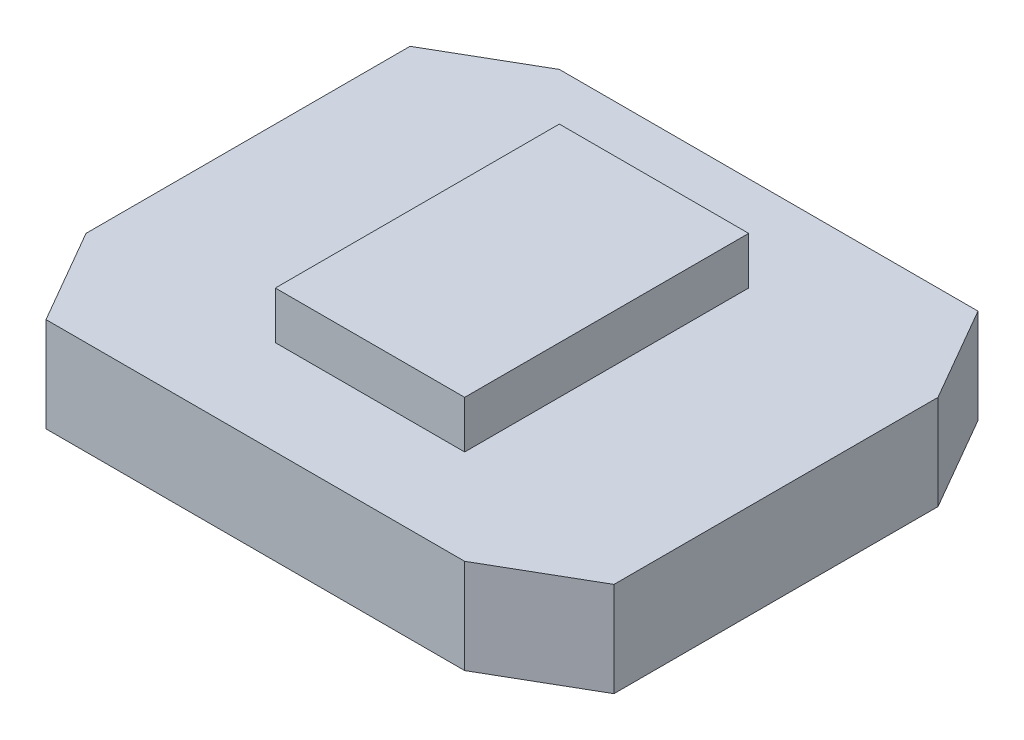
ISO-10303-21;
HEADER;
FILE_DESCRIPTION(('STEP AP214'),'2;1');
FILE_NAME('part.step','',(''),(''),'','','');
FILE_SCHEMA(('AUTOMOTIVE_DESIGN { 1 0 10303 214 1 1 1 1 }'));
ENDSEC;
DATA;
#1=APPLICATION_CONTEXT('core data for automotive mechanical design processes');
#2=APPLICATION_PROTOCOL_DEFINITION('international standard','automotive_design',2000,#1);
#3=PRODUCT_CONTEXT('',#1,'mechanical');
#4=PRODUCT('Part','Part','',(#3));
#5=PRODUCT_RELATED_PRODUCT_CATEGORY('part','',(#4));
#6=PRODUCT_DEFINITION_FORMATION('','',#4);
#7=PRODUCT_DEFINITION_CONTEXT('part definition',#1,'design');
#8=PRODUCT_DEFINITION('design','',#6,#7);
#9=PRODUCT_DEFINITION_SHAPE('','',#8);
#10=(LENGTH_UNIT() NAMED_UNIT(*) SI_UNIT(.MILLI.,.METRE.));
#11=(NAMED_UNIT(*) PLANE_ANGLE_UNIT() SI_UNIT($,.RADIAN.));
#12=(NAMED_UNIT(*) SI_UNIT($,.STERADIAN.) SOLID_ANGLE_UNIT());
#13=UNCERTAINTY_MEASURE_WITH_UNIT(LENGTH_MEASURE(1.E-05),#10,'distance_accuracy_value','');
#14=(GEOMETRIC_REPRESENTATION_CONTEXT(3) GLOBAL_UNCERTAINTY_ASSIGNED_CONTEXT((#13)) GLOBAL_UNIT_ASSIGNED_CONTEXT((#10,
#11,#12)) REPRESENTATION_CONTEXT('',''));
#15=CARTESIAN_POINT('',(0.,0.,0.));
#16=DIRECTION('',(0.,0.,1.));
#17=DIRECTION('',(1.,0.,0.));
#18=AXIS2_PLACEMENT_3D('',#15,#16,#17);
#19=CARTESIAN_POINT('',(30.,15.,-25.));
#20=DIRECTION('',(-1.,0.,0.));
#21=DIRECTION('',(0.,0.,1.));
#22=AXIS2_PLACEMENT_3D('',#19,#20,#21);
#23=PLANE('',#22);
#24=DIRECTION('',(0.,0.,-1.));
#25=VECTOR('',#24,1.);
#26=CARTESIAN_POINT('',(30.,10.,0.));
#27=LINE('',#26,#25);
#28=CARTESIAN_POINT('',(30.,10.,19.2264973081037));
#29=VERTEX_POINT('',#28);
#30=CARTESIAN_POINT('',(30.,10.,-14.9999999999999));
#31=VERTEX_POINT('',#30);
#32=EDGE_CURVE('E134',#29,#31,#27,.T.);
#33=ORIENTED_EDGE('',*,*,#32,.F.);
#34=DIRECTION('',(0.,-1.,0.));
#35=VECTOR('',#34,1.);
#36=CARTESIAN_POINT('',(30.,15.,19.2264973081037));
#37=LINE('',#36,#35);
#38=CARTESIAN_POINT('',(30.,0.,19.2264973081037));
#39=VERTEX_POINT('',#38);
#40=EDGE_CURVE('E156',#29,#39,#37,.T.);
#41=ORIENTED_EDGE('',*,*,#40,.T.);
#42=DIRECTION('',(0.,0.,-1.));
#43=VECTOR('',#42,1.);
#44=CARTESIAN_POINT('',(30.,0.,-25.));
#45=LINE('',#44,#43);
#46=CARTESIAN_POINT('',(30.,0.,-14.9999999999999));
#47=VERTEX_POINT('',#46);
#48=EDGE_CURVE('E196',#39,#47,#45,.T.);
#49=ORIENTED_EDGE('',*,*,#48,.T.);
#50=DIRECTION('',(0.,1.,0.));
#51=VECTOR('',#50,1.);
#52=CARTESIAN_POINT('',(30.,15.,-14.9999999999999));
#53=LINE('',#52,#51);
#54=EDGE_CURVE('E162',#47,#31,#53,.T.);
#55=ORIENTED_EDGE('',*,*,#54,.T.);
#56=EDGE_LOOP('',(#33,#41,#49,#55));
#57=FACE_BOUND('',#56,.T.);
#58=ADVANCED_FACE('F39',(#57),#23,.F.);
#59=CARTESIAN_POINT('',(-30.,15.,-25.));
#60=DIRECTION('',(0.,0.,1.));
#61=DIRECTION('',(1.,0.,0.));
#62=AXIS2_PLACEMENT_3D('',#59,#60,#61);
#63=PLANE('',#62);
#64=DIRECTION('',(-1.,0.,0.));
#65=VECTOR('',#64,1.);
#66=CARTESIAN_POINT('',(0.,10.,-25.));
#67=LINE('',#66,#65);
#68=CARTESIAN_POINT('',(24.2264973081037,10.,-25.));
#69=VERTEX_POINT('',#68);
#70=CARTESIAN_POINT('',(-20.,10.,-25.));
#71=VERTEX_POINT('',#70);
#72=EDGE_CURVE('E131',#69,#71,#67,.T.);
#73=ORIENTED_EDGE('',*,*,#72,.F.);
#74=DIRECTION('',(0.,-1.,0.));
#75=VECTOR('',#74,1.);
#76=CARTESIAN_POINT('',(24.2264973081037,15.,-25.));
#77=LINE('',#76,#75);
#78=CARTESIAN_POINT('',(24.2264973081037,0.,-25.));
#79=VERTEX_POINT('',#78);
#80=EDGE_CURVE('E145',#69,#79,#77,.T.);
#81=ORIENTED_EDGE('',*,*,#80,.T.);
#82=DIRECTION('',(-1.,0.,0.));
#83=VECTOR('',#82,1.);
#84=CARTESIAN_POINT('',(-30.,0.,-25.));
#85=LINE('',#84,#83);
#86=CARTESIAN_POINT('',(-20.,0.,-25.));
#87=VERTEX_POINT('',#86);
#88=EDGE_CURVE('E190',#79,#87,#85,.T.);
#89=ORIENTED_EDGE('',*,*,#88,.T.);
#90=DIRECTION('',(0.,1.,0.));
#91=VECTOR('',#90,1.);
#92=CARTESIAN_POINT('',(-20.,15.,-25.));
#93=LINE('',#92,#91);
#94=EDGE_CURVE('E148',#87,#71,#93,.T.);
#95=ORIENTED_EDGE('',*,*,#94,.T.);
#96=EDGE_LOOP('',(#73,#81,#89,#95));
#97=FACE_BOUND('',#96,.T.);
#98=ADVANCED_FACE('F143',(#97),#63,.F.);
#99=CARTESIAN_POINT('',(-30.,15.,-25.));
#100=DIRECTION('',(1.,0.,0.));
#101=DIRECTION('',(0.,0.,-1.));
#102=AXIS2_PLACEMENT_3D('',#99,#100,#101);
#103=PLANE('',#102);
#104=DIRECTION('',(0.,0.,1.));
#105=VECTOR('',#104,1.);
#106=CARTESIAN_POINT('',(-30.,10.,0.));
#107=LINE('',#106,#105);
#108=CARTESIAN_POINT('',(-30.,10.,-19.2264973081037));
#109=VERTEX_POINT('',#108);
#110=CARTESIAN_POINT('',(-30.,10.,14.9999999999999));
#111=VERTEX_POINT('',#110);
#112=EDGE_CURVE('E63',#109,#111,#107,.T.);
#113=ORIENTED_EDGE('',*,*,#112,.F.);
#114=DIRECTION('',(0.,-1.,0.));
#115=VECTOR('',#114,1.);
#116=CARTESIAN_POINT('',(-30.,15.,-19.2264973081037));
#117=LINE('',#116,#115);
#118=CARTESIAN_POINT('',(-30.,0.,-19.2264973081037));
#119=VERTEX_POINT('',#118);
#120=EDGE_CURVE('E182',#109,#119,#117,.T.);
#121=ORIENTED_EDGE('',*,*,#120,.T.);
#122=DIRECTION('',(0.,0.,1.));
#123=VECTOR('',#122,1.);
#124=CARTESIAN_POINT('',(-30.,0.,-25.));
#125=LINE('',#124,#123);
#126=CARTESIAN_POINT('',(-30.,0.,14.9999999999999));
#127=VERTEX_POINT('',#126);
#128=EDGE_CURVE('E187',#119,#127,#125,.T.);
#129=ORIENTED_EDGE('',*,*,#128,.T.);
#130=DIRECTION('',(0.,1.,0.));
#131=VECTOR('',#130,1.);
#132=CARTESIAN_POINT('',(-30.,15.,14.9999999999999));
#133=LINE('',#132,#131);
#134=EDGE_CURVE('E177',#127,#111,#133,.T.);
#135=ORIENTED_EDGE('',*,*,#134,.T.);
#136=EDGE_LOOP('',(#113,#121,#129,#135));
#137=FACE_BOUND('',#136,.T.);
#138=ADVANCED_FACE('F240',(#137),#103,.F.);
#139=CARTESIAN_POINT('',(-30.,15.,25.));
#140=DIRECTION('',(0.,0.,-1.));
#141=DIRECTION('',(-1.,0.,0.));
#142=AXIS2_PLACEMENT_3D('',#139,#140,#141);
#143=PLANE('',#142);
#144=DIRECTION('',(1.,0.,0.));
#145=VECTOR('',#144,1.);
#146=CARTESIAN_POINT('',(0.,10.,25.));
#147=LINE('',#146,#145);
#148=CARTESIAN_POINT('',(-24.2264973081037,10.,25.));
#149=VERTEX_POINT('',#148);
#150=CARTESIAN_POINT('',(20.,10.,25.));
#151=VERTEX_POINT('',#150);
#152=EDGE_CURVE('E172',#149,#151,#147,.T.);
#153=ORIENTED_EDGE('',*,*,#152,.F.);
#154=DIRECTION('',(0.,-1.,0.));
#155=VECTOR('',#154,1.);
#156=CARTESIAN_POINT('',(-24.2264973081037,15.,25.));
#157=LINE('',#156,#155);
#158=CARTESIAN_POINT('',(-24.2264973081037,0.,25.));
#159=VERTEX_POINT('',#158);
#160=EDGE_CURVE('E48',#149,#159,#157,.T.);
#161=ORIENTED_EDGE('',*,*,#160,.T.);
#162=DIRECTION('',(1.,0.,0.));
#163=VECTOR('',#162,1.);
#164=CARTESIAN_POINT('',(-30.,0.,25.));
#165=LINE('',#164,#163);
#166=CARTESIAN_POINT('',(20.,0.,25.));
#167=VERTEX_POINT('',#166);
#168=EDGE_CURVE('E170',#159,#167,#165,.T.);
#169=ORIENTED_EDGE('',*,*,#168,.T.);
#170=DIRECTION('',(0.,1.,0.));
#171=VECTOR('',#170,1.);
#172=CARTESIAN_POINT('',(20.,15.,25.));
#173=LINE('',#172,#171);
#174=EDGE_CURVE('E11',#167,#151,#173,.T.);
#175=ORIENTED_EDGE('',*,*,#174,.T.);
#176=EDGE_LOOP('',(#153,#161,#169,#175));
#177=FACE_BOUND('',#176,.T.);
#178=ADVANCED_FACE('F168',(#177),#143,.F.);
#179=CARTESIAN_POINT('',(-30.,15.,-19.2264973081037));
#180=DIRECTION('',(0.499999999999999,0.,0.866025403784439));
#181=DIRECTION('',(0.,-1.,0.));
#182=AXIS2_PLACEMENT_3D('',#179,#180,#181);
#183=PLANE('',#182);
#184=ORIENTED_EDGE('',*,*,#120,.F.);
#185=DIRECTION('',(-0.86602540378444,0.,0.499999999999999));
#186=VECTOR('',#185,1.);
#187=CARTESIAN_POINT('',(-15.8253175473054,10.,-27.4102540378444));
#188=LINE('',#187,#186);
#189=EDGE_CURVE('E149',#71,#109,#188,.T.);
#190=ORIENTED_EDGE('',*,*,#189,.F.);
#191=ORIENTED_EDGE('',*,*,#94,.F.);
#192=DIRECTION('',(-0.866025403784439,0.,0.499999999999999));
#193=VECTOR('',#192,1.);
#194=CARTESIAN_POINT('',(-30.,0.,-19.2264973081037));
#195=LINE('',#194,#193);
#196=EDGE_CURVE('E154',#119,#87,#195,.F.);
#197=ORIENTED_EDGE('',*,*,#196,.F.);
#198=EDGE_LOOP('',(#184,#190,#191,#197));
#199=FACE_BOUND('',#198,.T.);
#200=ADVANCED_FACE('F242',(#199),#183,.F.);
#201=CARTESIAN_POINT('',(24.2264973081037,15.,-25.));
#202=DIRECTION('',(-0.86602540378444,0.,0.499999999999998));
#203=DIRECTION('',(0.,-1.,0.));
#204=AXIS2_PLACEMENT_3D('',#201,#202,#203);
#205=PLANE('',#204);
#206=ORIENTED_EDGE('',*,*,#80,.F.);
#207=DIRECTION('',(-0.499999999999998,0.,-0.86602540378444));
#208=VECTOR('',#207,1.);
#209=CARTESIAN_POINT('',(28.9951905283833,10.,-16.7403810567665));
#210=LINE('',#209,#208);
#211=EDGE_CURVE('E127',#31,#69,#210,.T.);
#212=ORIENTED_EDGE('',*,*,#211,.F.);
#213=ORIENTED_EDGE('',*,*,#54,.F.);
#214=DIRECTION('',(-0.499999999999998,0.,-0.86602540378444));
#215=VECTOR('',#214,1.);
#216=CARTESIAN_POINT('',(24.2264973081037,0.,-25.));
#217=LINE('',#216,#215);
#218=EDGE_CURVE('E152',#79,#47,#217,.F.);
#219=ORIENTED_EDGE('',*,*,#218,.F.);
#220=EDGE_LOOP('',(#206,#212,#213,#219));
#221=FACE_BOUND('',#220,.T.);
#222=ADVANCED_FACE('F151',(#221),#205,.F.);
#223=CARTESIAN_POINT('',(30.,15.,19.2264973081037));
#224=DIRECTION('',(-0.499999999999999,0.,-0.86602540378444));
#225=DIRECTION('',(0.,-1.,0.));
#226=AXIS2_PLACEMENT_3D('',#223,#224,#225);
#227=PLANE('',#226);
#228=ORIENTED_EDGE('',*,*,#40,.F.);
#229=DIRECTION('',(0.86602540378444,0.,-0.499999999999999));
#230=VECTOR('',#229,1.);
#231=CARTESIAN_POINT('',(15.8253175473054,10.,27.4102540378444));
#232=LINE('',#231,#230);
#233=EDGE_CURVE('E231',#151,#29,#232,.T.);
#234=ORIENTED_EDGE('',*,*,#233,.F.);
#235=ORIENTED_EDGE('',*,*,#174,.F.);
#236=DIRECTION('',(0.86602540378444,0.,-0.499999999999999));
#237=VECTOR('',#236,1.);
#238=CARTESIAN_POINT('',(30.,0.,19.2264973081037));
#239=LINE('',#238,#237);
#240=EDGE_CURVE('E181',#39,#167,#239,.F.);
#241=ORIENTED_EDGE('',*,*,#240,.F.);
#242=EDGE_LOOP('',(#228,#234,#235,#241));
#243=FACE_BOUND('',#242,.T.);
#244=ADVANCED_FACE('F249',(#243),#227,.F.);
#245=CARTESIAN_POINT('',(-24.2264973081037,15.,25.));
#246=DIRECTION('',(0.86602540378444,0.,-0.499999999999998));
#247=DIRECTION('',(0.,-1.,0.));
#248=AXIS2_PLACEMENT_3D('',#245,#246,#247);
#249=PLANE('',#248);
#250=ORIENTED_EDGE('',*,*,#160,.F.);
#251=DIRECTION('',(0.499999999999998,0.,0.86602540378444));
#252=VECTOR('',#251,1.);
#253=CARTESIAN_POINT('',(-28.9951905283833,10.,16.7403810567665));
#254=LINE('',#253,#252);
#255=EDGE_CURVE('E234',#111,#149,#254,.T.);
#256=ORIENTED_EDGE('',*,*,#255,.F.);
#257=ORIENTED_EDGE('',*,*,#134,.F.);
#258=DIRECTION('',(0.499999999999998,0.,0.86602540378444));
#259=VECTOR('',#258,1.);
#260=CARTESIAN_POINT('',(-24.2264973081037,0.,25.));
#261=LINE('',#260,#259);
#262=EDGE_CURVE('E175',#159,#127,#261,.F.);
#263=ORIENTED_EDGE('',*,*,#262,.F.);
#264=EDGE_LOOP('',(#250,#256,#257,#263));
#265=FACE_BOUND('',#264,.T.);
#266=ADVANCED_FACE('F42',(#265),#249,.F.);
#267=CARTESIAN_POINT('',(0.,0.,0.));
#268=DIRECTION('',(0.,1.,0.));
#269=DIRECTION('',(0.,0.,1.));
#270=AXIS2_PLACEMENT_3D('',#267,#268,#269);
#271=PLANE('',#270);
#272=ORIENTED_EDGE('',*,*,#128,.F.);
#273=ORIENTED_EDGE('',*,*,#196,.T.);
#274=ORIENTED_EDGE('',*,*,#88,.F.);
#275=ORIENTED_EDGE('',*,*,#218,.T.);
#276=ORIENTED_EDGE('',*,*,#48,.F.);
#277=ORIENTED_EDGE('',*,*,#240,.T.);
#278=ORIENTED_EDGE('',*,*,#168,.F.);
#279=ORIENTED_EDGE('',*,*,#262,.T.);
#280=EDGE_LOOP('',(#272,#273,#274,#275,#276,#277,#278,#279));
#281=FACE_BOUND('',#280,.T.);
#282=ADVANCED_FACE('F184',(#281),#271,.F.);
#283=CARTESIAN_POINT('',(0.,10.,-15.));
#284=DIRECTION('',(0.,0.,1.));
#285=DIRECTION('',(1.,0.,0.));
#286=AXIS2_PLACEMENT_3D('',#283,#284,#285);
#287=PLANE('',#286);
#288=DIRECTION('',(1.,0.,0.));
#289=VECTOR('',#288,1.);
#290=CARTESIAN_POINT('',(0.,15.,-15.));
#291=LINE('',#290,#289);
#292=CARTESIAN_POINT('',(-10.,15.,-15.));
#293=VERTEX_POINT('',#292);
#294=CARTESIAN_POINT('',(10.,15.,-15.));
#295=VERTEX_POINT('',#294);
#296=EDGE_CURVE('E55',#293,#295,#291,.T.);
#297=ORIENTED_EDGE('',*,*,#296,.T.);
#298=DIRECTION('',(0.,1.,0.));
#299=VECTOR('',#298,1.);
#300=CARTESIAN_POINT('',(10.,10.,-15.));
#301=LINE('',#300,#299);
#302=CARTESIAN_POINT('',(10.,10.,-15.));
#303=VERTEX_POINT('',#302);
#304=EDGE_CURVE('E204',#303,#295,#301,.T.);
#305=ORIENTED_EDGE('',*,*,#304,.F.);
#306=DIRECTION('',(1.,0.,0.));
#307=VECTOR('',#306,1.);
#308=CARTESIAN_POINT('',(0.,10.,-15.));
#309=LINE('',#308,#307);
#310=CARTESIAN_POINT('',(-10.,10.,-15.));
#311=VERTEX_POINT('',#310);
#312=EDGE_CURVE('E227',#311,#303,#309,.T.);
#313=ORIENTED_EDGE('',*,*,#312,.F.);
#314=DIRECTION('',(0.,1.,0.));
#315=VECTOR('',#314,1.);
#316=CARTESIAN_POINT('',(-10.,10.,-15.));
#317=LINE('',#316,#315);
#318=EDGE_CURVE('E199',#311,#293,#317,.T.);
#319=ORIENTED_EDGE('',*,*,#318,.T.);
#320=EDGE_LOOP('',(#297,#305,#313,#319));
#321=FACE_BOUND('',#320,.T.);
#322=ADVANCED_FACE('F264',(#321),#287,.F.);
#323=CARTESIAN_POINT('',(-10.,10.,0.));
#324=DIRECTION('',(-1.,0.,0.));
#325=DIRECTION('',(0.,0.,1.));
#326=AXIS2_PLACEMENT_3D('',#323,#324,#325);
#327=PLANE('',#326);
#328=DIRECTION('',(0.,0.,1.));
#329=VECTOR('',#328,1.);
#330=CARTESIAN_POINT('',(-10.,15.,0.));
#331=LINE('',#330,#329);
#332=CARTESIAN_POINT('',(-10.,15.,15.));
#333=VERTEX_POINT('',#332);
#334=EDGE_CURVE('E139',#293,#333,#331,.T.);
#335=ORIENTED_EDGE('',*,*,#334,.F.);
#336=ORIENTED_EDGE('',*,*,#318,.F.);
#337=DIRECTION('',(0.,0.,1.));
#338=VECTOR('',#337,1.);
#339=CARTESIAN_POINT('',(-10.,10.,0.));
#340=LINE('',#339,#338);
#341=CARTESIAN_POINT('',(-10.,10.,15.));
#342=VERTEX_POINT('',#341);
#343=EDGE_CURVE('E207',#311,#342,#340,.T.);
#344=ORIENTED_EDGE('',*,*,#343,.T.);
#345=DIRECTION('',(0.,1.,0.));
#346=VECTOR('',#345,1.);
#347=CARTESIAN_POINT('',(-10.,10.,15.));
#348=LINE('',#347,#346);
#349=EDGE_CURVE('E201',#342,#333,#348,.T.);
#350=ORIENTED_EDGE('',*,*,#349,.T.);
#351=EDGE_LOOP('',(#335,#336,#344,#350));
#352=FACE_BOUND('',#351,.T.);
#353=ADVANCED_FACE('F271',(#352),#327,.T.);
#354=CARTESIAN_POINT('',(0.,10.,15.));
#355=DIRECTION('',(0.,0.,1.));
#356=DIRECTION('',(1.,0.,0.));
#357=AXIS2_PLACEMENT_3D('',#354,#355,#356);
#358=PLANE('',#357);
#359=DIRECTION('',(1.,0.,0.));
#360=VECTOR('',#359,1.);
#361=CARTESIAN_POINT('',(0.,15.,15.));
#362=LINE('',#361,#360);
#363=CARTESIAN_POINT('',(10.,15.,15.));
#364=VERTEX_POINT('',#363);
#365=EDGE_CURVE('E213',#333,#364,#362,.T.);
#366=ORIENTED_EDGE('',*,*,#365,.F.);
#367=ORIENTED_EDGE('',*,*,#349,.F.);
#368=DIRECTION('',(1.,0.,0.));
#369=VECTOR('',#368,1.);
#370=CARTESIAN_POINT('',(0.,10.,15.));
#371=LINE('',#370,#369);
#372=CARTESIAN_POINT('',(10.,10.,15.));
#373=VERTEX_POINT('',#372);
#374=EDGE_CURVE('E222',#342,#373,#371,.T.);
#375=ORIENTED_EDGE('',*,*,#374,.T.);
#376=DIRECTION('',(0.,1.,0.));
#377=VECTOR('',#376,1.);
#378=CARTESIAN_POINT('',(10.,10.,15.));
#379=LINE('',#378,#377);
#380=EDGE_CURVE('E206',#373,#364,#379,.T.);
#381=ORIENTED_EDGE('',*,*,#380,.T.);
#382=EDGE_LOOP('',(#366,#367,#375,#381));
#383=FACE_BOUND('',#382,.T.);
#384=ADVANCED_FACE('F275',(#383),#358,.T.);
#385=CARTESIAN_POINT('',(10.,10.,0.));
#386=DIRECTION('',(-1.,0.,0.));
#387=DIRECTION('',(0.,0.,1.));
#388=AXIS2_PLACEMENT_3D('',#385,#386,#387);
#389=PLANE('',#388);
#390=DIRECTION('',(0.,0.,1.));
#391=VECTOR('',#390,1.);
#392=CARTESIAN_POINT('',(10.,15.,0.));
#393=LINE('',#392,#391);
#394=EDGE_CURVE('E216',#295,#364,#393,.T.);
#395=ORIENTED_EDGE('',*,*,#394,.T.);
#396=ORIENTED_EDGE('',*,*,#380,.F.);
#397=DIRECTION('',(0.,0.,1.));
#398=VECTOR('',#397,1.);
#399=CARTESIAN_POINT('',(10.,10.,0.));
#400=LINE('',#399,#398);
#401=EDGE_CURVE('E224',#303,#373,#400,.T.);
#402=ORIENTED_EDGE('',*,*,#401,.F.);
#403=ORIENTED_EDGE('',*,*,#304,.T.);
#404=EDGE_LOOP('',(#395,#396,#402,#403));
#405=FACE_BOUND('',#404,.T.);
#406=ADVANCED_FACE('F272',(#405),#389,.F.);
#407=CARTESIAN_POINT('',(0.,10.,0.));
#408=DIRECTION('',(0.,1.,0.));
#409=DIRECTION('',(0.,0.,1.));
#410=AXIS2_PLACEMENT_3D('',#407,#408,#409);
#411=PLANE('',#410);
#412=ORIENTED_EDGE('',*,*,#211,.T.);
#413=ORIENTED_EDGE('',*,*,#72,.T.);
#414=ORIENTED_EDGE('',*,*,#189,.T.);
#415=ORIENTED_EDGE('',*,*,#112,.T.);
#416=ORIENTED_EDGE('',*,*,#255,.T.);
#417=ORIENTED_EDGE('',*,*,#152,.T.);
#418=ORIENTED_EDGE('',*,*,#233,.T.);
#419=ORIENTED_EDGE('',*,*,#32,.T.);
#420=EDGE_LOOP('',(#412,#413,#414,#415,#416,#417,#418,#419));
#421=FACE_BOUND('',#420,.T.);
#422=ORIENTED_EDGE('',*,*,#312,.T.);
#423=ORIENTED_EDGE('',*,*,#401,.T.);
#424=ORIENTED_EDGE('',*,*,#374,.F.);
#425=ORIENTED_EDGE('',*,*,#343,.F.);
#426=EDGE_LOOP('',(#422,#423,#424,#425));
#427=FACE_BOUND('',#426,.T.);
#428=ADVANCED_FACE('F129',(#421,#427),#411,.T.);
#429=CARTESIAN_POINT('',(0.,15.,0.));
#430=DIRECTION('',(0.,1.,0.));
#431=DIRECTION('',(0.,0.,1.));
#432=AXIS2_PLACEMENT_3D('',#429,#430,#431);
#433=PLANE('',#432);
#434=ORIENTED_EDGE('',*,*,#296,.F.);
#435=ORIENTED_EDGE('',*,*,#334,.T.);
#436=ORIENTED_EDGE('',*,*,#365,.T.);
#437=ORIENTED_EDGE('',*,*,#394,.F.);
#438=EDGE_LOOP('',(#434,#435,#436,#437));
#439=FACE_BOUND('',#438,.T.);
#440=ADVANCED_FACE('F265',(#439),#433,.T.);
#441=CLOSED_SHELL('',(#58,#98,#138,#178,#200,#222,#244,#266,#282,#322,#353,#384,#406,#428,#440));
#442=MANIFOLD_SOLID_BREP('B2',#441);
#443=ADVANCED_BREP_SHAPE_REPRESENTATION('',(#18,#442),#14);
#444=SHAPE_DEFINITION_REPRESENTATION(#9,#443);
ENDSEC;
END-ISO-10303-21;
